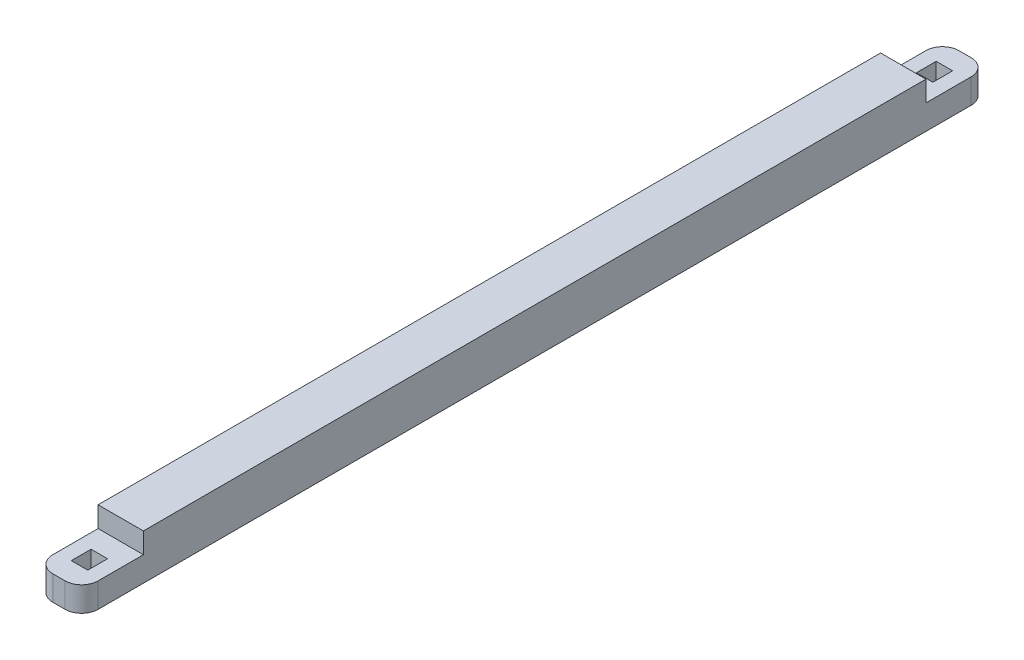
ISO-10303-21;
HEADER;
FILE_DESCRIPTION(('STEP AP214'),'2;1');
FILE_NAME('part.step','',(''),(''),'','','');
FILE_SCHEMA(('AUTOMOTIVE_DESIGN { 1 0 10303 214 1 1 1 1 }'));
ENDSEC;
DATA;
#1=APPLICATION_CONTEXT('core data for automotive mechanical design processes');
#2=APPLICATION_PROTOCOL_DEFINITION('international standard','automotive_design',2000,#1);
#3=PRODUCT_CONTEXT('',#1,'mechanical');
#4=PRODUCT('Part','Part','',(#3));
#5=PRODUCT_RELATED_PRODUCT_CATEGORY('part','',(#4));
#6=PRODUCT_DEFINITION_FORMATION('','',#4);
#7=PRODUCT_DEFINITION_CONTEXT('part definition',#1,'design');
#8=PRODUCT_DEFINITION('design','',#6,#7);
#9=PRODUCT_DEFINITION_SHAPE('','',#8);
#10=(LENGTH_UNIT() NAMED_UNIT(*) SI_UNIT(.MILLI.,.METRE.));
#11=(NAMED_UNIT(*) PLANE_ANGLE_UNIT() SI_UNIT($,.RADIAN.));
#12=(NAMED_UNIT(*) SI_UNIT($,.STERADIAN.) SOLID_ANGLE_UNIT());
#13=UNCERTAINTY_MEASURE_WITH_UNIT(LENGTH_MEASURE(1.E-05),#10,'distance_accuracy_value','');
#14=(GEOMETRIC_REPRESENTATION_CONTEXT(3) GLOBAL_UNCERTAINTY_ASSIGNED_CONTEXT((#13)) GLOBAL_UNIT_ASSIGNED_CONTEXT((#10,
#11,#12)) REPRESENTATION_CONTEXT('',''));
#15=CARTESIAN_POINT('',(0.,0.,0.));
#16=DIRECTION('',(0.,0.,1.));
#17=DIRECTION('',(1.,0.,0.));
#18=AXIS2_PLACEMENT_3D('',#15,#16,#17);
#19=CARTESIAN_POINT('',(168.743664037034,78.7240727028034,698.5));
#20=DIRECTION('',(1.,0.,0.));
#21=DIRECTION('',(0.,0.,-1.));
#22=AXIS2_PLACEMENT_3D('',#19,#20,#21);
#23=PLANE('',#22);
#24=DIRECTION('',(0.,0.,-1.));
#25=VECTOR('',#24,1.);
#26=CARTESIAN_POINT('',(168.743664037034,62.8490727028044,698.5));
#27=LINE('',#26,#25);
#28=CARTESIAN_POINT('',(168.743664037034,62.8490727028035,47.625));
#29=VERTEX_POINT('',#28);
#30=CARTESIAN_POINT('',(168.743664037034,62.8490727028034,12.7));
#31=VERTEX_POINT('',#30);
#32=EDGE_CURVE('E263',#29,#31,#27,.T.);
#33=ORIENTED_EDGE('',*,*,#32,.T.);
#34=DIRECTION('',(0.,-1.,0.));
#35=VECTOR('',#34,1.);
#36=CARTESIAN_POINT('',(168.743664037034,78.7240727028034,12.7));
#37=LINE('',#36,#35);
#38=CARTESIAN_POINT('',(168.743664037034,43.7990727028034,12.7));
#39=VERTEX_POINT('',#38);
#40=EDGE_CURVE('E323',#31,#39,#37,.T.);
#41=ORIENTED_EDGE('',*,*,#40,.T.);
#42=DIRECTION('',(0.,0.,-1.));
#43=VECTOR('',#42,1.);
#44=CARTESIAN_POINT('',(168.743664037034,43.7990727028034,698.5));
#45=LINE('',#44,#43);
#46=CARTESIAN_POINT('',(168.743664037034,43.7990727028034,685.8));
#47=VERTEX_POINT('',#46);
#48=EDGE_CURVE('E311',#47,#39,#45,.T.);
#49=ORIENTED_EDGE('',*,*,#48,.F.);
#50=DIRECTION('',(0.,-1.,0.));
#51=VECTOR('',#50,1.);
#52=CARTESIAN_POINT('',(168.743664037034,62.8490727028034,685.8));
#53=LINE('',#52,#51);
#54=CARTESIAN_POINT('',(168.743664037034,62.8490727028034,685.8));
#55=VERTEX_POINT('',#54);
#56=EDGE_CURVE('E321',#47,#55,#53,.F.);
#57=ORIENTED_EDGE('',*,*,#56,.T.);
#58=DIRECTION('',(0.,0.,-1.));
#59=VECTOR('',#58,1.);
#60=CARTESIAN_POINT('',(168.743664037034,62.8490727028034,698.5));
#61=LINE('',#60,#59);
#62=CARTESIAN_POINT('',(168.743664037034,62.8490727028034,650.875));
#63=VERTEX_POINT('',#62);
#64=EDGE_CURVE('E282',#55,#63,#61,.T.);
#65=ORIENTED_EDGE('',*,*,#64,.T.);
#66=DIRECTION('',(0.,1.,0.));
#67=VECTOR('',#66,1.);
#68=CARTESIAN_POINT('',(168.743664037034,78.7240727028034,650.875));
#69=LINE('',#68,#67);
#70=CARTESIAN_POINT('',(168.743664037034,78.7240727028034,650.875));
#71=VERTEX_POINT('',#70);
#72=EDGE_CURVE('E288',#63,#71,#69,.T.);
#73=ORIENTED_EDGE('',*,*,#72,.T.);
#74=DIRECTION('',(0.,0.,-1.));
#75=VECTOR('',#74,1.);
#76=CARTESIAN_POINT('',(168.743664037034,78.7240727028034,698.5));
#77=LINE('',#76,#75);
#78=CARTESIAN_POINT('',(168.743664037034,78.7240727028035,47.625));
#79=VERTEX_POINT('',#78);
#80=EDGE_CURVE('E297',#71,#79,#77,.T.);
#81=ORIENTED_EDGE('',*,*,#80,.T.);
#82=DIRECTION('',(0.,-1.,0.));
#83=VECTOR('',#82,1.);
#84=CARTESIAN_POINT('',(168.743664037034,78.7240727028034,47.625));
#85=LINE('',#84,#83);
#86=EDGE_CURVE('E268',#79,#29,#85,.T.);
#87=ORIENTED_EDGE('',*,*,#86,.T.);
#88=EDGE_LOOP('',(#33,#41,#49,#57,#65,#73,#81,#87));
#89=FACE_BOUND('',#88,.T.);
#90=ADVANCED_FACE('F34',(#89),#23,.F.);
#91=CARTESIAN_POINT('',(168.743664037034,43.7990727028034,698.5));
#92=DIRECTION('',(0.,1.,0.));
#93=DIRECTION('',(0.,0.,1.));
#94=AXIS2_PLACEMENT_3D('',#91,#92,#93);
#95=PLANE('',#94);
#96=DIRECTION('',(-1.,0.,0.));
#97=VECTOR('',#96,1.);
#98=CARTESIAN_POINT('',(179.856164037034,43.7990727028034,15.8750000000001));
#99=LINE('',#98,#97);
#100=CARTESIAN_POINT('',(192.556164037034,43.7990727028034,15.8750000000001));
#101=VERTEX_POINT('',#100);
#102=CARTESIAN_POINT('',(179.856164037034,43.7990727028034,15.8750000000001));
#103=VERTEX_POINT('',#102);
#104=EDGE_CURVE('E183',#101,#103,#99,.T.);
#105=ORIENTED_EDGE('',*,*,#104,.T.);
#106=DIRECTION('',(0.,0.,1.));
#107=VECTOR('',#106,1.);
#108=CARTESIAN_POINT('',(179.856164037034,43.7990727028034,31.115));
#109=LINE('',#108,#107);
#110=CARTESIAN_POINT('',(179.856164037034,43.7990727028034,31.115));
#111=VERTEX_POINT('',#110);
#112=EDGE_CURVE('E175',#103,#111,#109,.T.);
#113=ORIENTED_EDGE('',*,*,#112,.T.);
#114=DIRECTION('',(1.,0.,0.));
#115=VECTOR('',#114,1.);
#116=CARTESIAN_POINT('',(179.856164037034,43.7990727028034,31.115));
#117=LINE('',#116,#115);
#118=CARTESIAN_POINT('',(192.556164037034,43.7990727028034,31.115));
#119=VERTEX_POINT('',#118);
#120=EDGE_CURVE('E187',#111,#119,#117,.T.);
#121=ORIENTED_EDGE('',*,*,#120,.T.);
#122=DIRECTION('',(0.,0.,-1.));
#123=VECTOR('',#122,1.);
#124=CARTESIAN_POINT('',(192.556164037034,43.7990727028034,31.115));
#125=LINE('',#124,#123);
#126=EDGE_CURVE('E191',#119,#101,#125,.T.);
#127=ORIENTED_EDGE('',*,*,#126,.T.);
#128=EDGE_LOOP('',(#105,#113,#121,#127));
#129=FACE_BOUND('',#128,.T.);
#130=DIRECTION('',(-1.,0.,0.));
#131=VECTOR('',#130,1.);
#132=CARTESIAN_POINT('',(179.856164037034,43.7990727028032,667.385));
#133=LINE('',#132,#131);
#134=CARTESIAN_POINT('',(192.556164037034,43.7990727028032,667.385));
#135=VERTEX_POINT('',#134);
#136=CARTESIAN_POINT('',(179.856164037034,43.7990727028032,667.385));
#137=VERTEX_POINT('',#136);
#138=EDGE_CURVE('E227',#135,#137,#133,.T.);
#139=ORIENTED_EDGE('',*,*,#138,.T.);
#140=DIRECTION('',(0.,0.,1.));
#141=VECTOR('',#140,1.);
#142=CARTESIAN_POINT('',(179.856164037034,43.7990727028032,667.385));
#143=LINE('',#142,#141);
#144=CARTESIAN_POINT('',(179.856164037034,43.7990727028032,682.625));
#145=VERTEX_POINT('',#144);
#146=EDGE_CURVE('E216',#137,#145,#143,.T.);
#147=ORIENTED_EDGE('',*,*,#146,.T.);
#148=DIRECTION('',(1.,0.,0.));
#149=VECTOR('',#148,1.);
#150=CARTESIAN_POINT('',(179.856164037034,43.7990727028032,682.625));
#151=LINE('',#150,#149);
#152=CARTESIAN_POINT('',(192.556164037034,43.7990727028034,682.625));
#153=VERTEX_POINT('',#152);
#154=EDGE_CURVE('E219',#145,#153,#151,.T.);
#155=ORIENTED_EDGE('',*,*,#154,.T.);
#156=DIRECTION('',(0.,0.,-1.));
#157=VECTOR('',#156,1.);
#158=CARTESIAN_POINT('',(192.556164037034,43.7990727028032,667.385));
#159=LINE('',#158,#157);
#160=EDGE_CURVE('E224',#153,#135,#159,.T.);
#161=ORIENTED_EDGE('',*,*,#160,.T.);
#162=EDGE_LOOP('',(#139,#147,#155,#161));
#163=FACE_BOUND('',#162,.T.);
#164=ORIENTED_EDGE('',*,*,#48,.T.);
#165=CARTESIAN_POINT('',(181.443664037034,43.7990727028034,12.7));
#166=DIRECTION('',(0.,1.,0.));
#167=DIRECTION('',(0.,0.,1.));
#168=AXIS2_PLACEMENT_3D('',#165,#166,#167);
#169=CIRCLE('',#168,12.7);
#170=CARTESIAN_POINT('',(181.443664037034,43.7990727028034,0.));
#171=VERTEX_POINT('',#170);
#172=EDGE_CURVE('E334',#39,#171,#169,.F.);
#173=ORIENTED_EDGE('',*,*,#172,.T.);
#174=DIRECTION('',(1.,0.,0.));
#175=VECTOR('',#174,1.);
#176=CARTESIAN_POINT('',(168.743664037034,43.7990727028034,0.));
#177=LINE('',#176,#175);
#178=CARTESIAN_POINT('',(190.968664037034,43.7990727028034,0.));
#179=VERTEX_POINT('',#178);
#180=EDGE_CURVE('E292',#171,#179,#177,.T.);
#181=ORIENTED_EDGE('',*,*,#180,.T.);
#182=CARTESIAN_POINT('',(190.968664037034,43.7990727028034,12.7));
#183=DIRECTION('',(0.,1.,0.));
#184=DIRECTION('',(0.,0.,1.));
#185=AXIS2_PLACEMENT_3D('',#182,#183,#184);
#186=CIRCLE('',#185,12.7);
#187=CARTESIAN_POINT('',(203.668664037034,43.7990727028034,12.7));
#188=VERTEX_POINT('',#187);
#189=EDGE_CURVE('E332',#179,#188,#186,.F.);
#190=ORIENTED_EDGE('',*,*,#189,.T.);
#191=DIRECTION('',(0.,0.,-1.));
#192=VECTOR('',#191,1.);
#193=CARTESIAN_POINT('',(203.668664037034,43.7990727028034,698.5));
#194=LINE('',#193,#192);
#195=CARTESIAN_POINT('',(203.668664037034,43.7990727028034,685.8));
#196=VERTEX_POINT('',#195);
#197=EDGE_CURVE('E307',#196,#188,#194,.T.);
#198=ORIENTED_EDGE('',*,*,#197,.F.);
#199=CARTESIAN_POINT('',(190.968664037034,43.7990727028034,685.8));
#200=DIRECTION('',(0.,1.,0.));
#201=DIRECTION('',(0.,0.,1.));
#202=AXIS2_PLACEMENT_3D('',#199,#200,#201);
#203=CIRCLE('',#202,12.7);
#204=CARTESIAN_POINT('',(190.968664037034,43.7990727028034,698.5));
#205=VERTEX_POINT('',#204);
#206=EDGE_CURVE('E329',#196,#205,#203,.F.);
#207=ORIENTED_EDGE('',*,*,#206,.T.);
#208=DIRECTION('',(1.,0.,0.));
#209=VECTOR('',#208,1.);
#210=CARTESIAN_POINT('',(168.743664037034,43.7990727028034,698.5));
#211=LINE('',#210,#209);
#212=CARTESIAN_POINT('',(181.443664037034,43.7990727028034,698.5));
#213=VERTEX_POINT('',#212);
#214=EDGE_CURVE('E293',#213,#205,#211,.T.);
#215=ORIENTED_EDGE('',*,*,#214,.F.);
#216=CARTESIAN_POINT('',(181.443664037034,43.7990727028034,685.8));
#217=DIRECTION('',(0.,1.,0.));
#218=DIRECTION('',(0.,0.,1.));
#219=AXIS2_PLACEMENT_3D('',#216,#217,#218);
#220=CIRCLE('',#219,12.7);
#221=EDGE_CURVE('E326',#213,#47,#220,.F.);
#222=ORIENTED_EDGE('',*,*,#221,.T.);
#223=EDGE_LOOP('',(#164,#173,#181,#190,#198,#207,#215,#222));
#224=FACE_BOUND('',#223,.T.);
#225=ADVANCED_FACE('F193',(#129,#163,#224),#95,.F.);
#226=CARTESIAN_POINT('',(203.668664037034,78.7240727028034,698.5));
#227=DIRECTION('',(-1.,0.,0.));
#228=DIRECTION('',(0.,0.,1.));
#229=AXIS2_PLACEMENT_3D('',#226,#227,#228);
#230=PLANE('',#229);
#231=ORIENTED_EDGE('',*,*,#197,.T.);
#232=DIRECTION('',(0.,1.,0.));
#233=VECTOR('',#232,1.);
#234=CARTESIAN_POINT('',(203.668664037034,78.7240727028034,12.7));
#235=LINE('',#234,#233);
#236=CARTESIAN_POINT('',(203.668664037034,62.8490727028034,12.7));
#237=VERTEX_POINT('',#236);
#238=EDGE_CURVE('E349',#188,#237,#235,.T.);
#239=ORIENTED_EDGE('',*,*,#238,.T.);
#240=DIRECTION('',(0.,0.,-1.));
#241=VECTOR('',#240,1.);
#242=CARTESIAN_POINT('',(203.668664037034,62.8490727028034,0.));
#243=LINE('',#242,#241);
#244=CARTESIAN_POINT('',(203.668664037034,62.8490727028035,47.625));
#245=VERTEX_POINT('',#244);
#246=EDGE_CURVE('E256',#245,#237,#243,.T.);
#247=ORIENTED_EDGE('',*,*,#246,.F.);
#248=DIRECTION('',(0.,-1.,0.));
#249=VECTOR('',#248,1.);
#250=CARTESIAN_POINT('',(203.668664037034,78.7240727028035,47.625));
#251=LINE('',#250,#249);
#252=CARTESIAN_POINT('',(203.668664037034,78.7240727028035,47.625));
#253=VERTEX_POINT('',#252);
#254=EDGE_CURVE('E246',#253,#245,#251,.T.);
#255=ORIENTED_EDGE('',*,*,#254,.F.);
#256=DIRECTION('',(0.,0.,-1.));
#257=VECTOR('',#256,1.);
#258=CARTESIAN_POINT('',(203.668664037034,78.7240727028034,698.5));
#259=LINE('',#258,#257);
#260=CARTESIAN_POINT('',(203.668664037034,78.7240727028034,650.875));
#261=VERTEX_POINT('',#260);
#262=EDGE_CURVE('E303',#261,#253,#259,.T.);
#263=ORIENTED_EDGE('',*,*,#262,.F.);
#264=DIRECTION('',(0.,1.,0.));
#265=VECTOR('',#264,1.);
#266=CARTESIAN_POINT('',(203.668664037034,78.7240727028034,650.875));
#267=LINE('',#266,#265);
#268=CARTESIAN_POINT('',(203.668664037034,62.8490727028034,650.875));
#269=VERTEX_POINT('',#268);
#270=EDGE_CURVE('E274',#269,#261,#267,.T.);
#271=ORIENTED_EDGE('',*,*,#270,.F.);
#272=DIRECTION('',(0.,0.,-1.));
#273=VECTOR('',#272,1.);
#274=CARTESIAN_POINT('',(203.668664037034,62.8490727028034,698.5));
#275=LINE('',#274,#273);
#276=CARTESIAN_POINT('',(203.668664037034,62.8490727028034,685.8));
#277=VERTEX_POINT('',#276);
#278=EDGE_CURVE('E271',#277,#269,#275,.T.);
#279=ORIENTED_EDGE('',*,*,#278,.F.);
#280=DIRECTION('',(0.,1.,0.));
#281=VECTOR('',#280,1.);
#282=CARTESIAN_POINT('',(203.668664037034,43.7990727028034,685.8));
#283=LINE('',#282,#281);
#284=EDGE_CURVE('E346',#277,#196,#283,.F.);
#285=ORIENTED_EDGE('',*,*,#284,.T.);
#286=EDGE_LOOP('',(#231,#239,#247,#255,#263,#271,#279,#285));
#287=FACE_BOUND('',#286,.T.);
#288=ADVANCED_FACE('F371',(#287),#230,.F.);
#289=CARTESIAN_POINT('',(168.743664037034,78.7240727028034,698.5));
#290=DIRECTION('',(0.,-1.,0.));
#291=DIRECTION('',(0.,0.,-1.));
#292=AXIS2_PLACEMENT_3D('',#289,#290,#291);
#293=PLANE('',#292);
#294=ORIENTED_EDGE('',*,*,#262,.T.);
#295=DIRECTION('',(1.,0.,0.));
#296=VECTOR('',#295,1.);
#297=CARTESIAN_POINT('',(76.668664037034,78.7240727028035,47.625));
#298=LINE('',#297,#296);
#299=EDGE_CURVE('E260',#79,#253,#298,.T.);
#300=ORIENTED_EDGE('',*,*,#299,.F.);
#301=ORIENTED_EDGE('',*,*,#80,.F.);
#302=DIRECTION('',(1.,0.,0.));
#303=VECTOR('',#302,1.);
#304=CARTESIAN_POINT('',(76.668664037034,78.7240727028034,650.875));
#305=LINE('',#304,#303);
#306=EDGE_CURVE('E278',#71,#261,#305,.T.);
#307=ORIENTED_EDGE('',*,*,#306,.T.);
#308=EDGE_LOOP('',(#294,#300,#301,#307));
#309=FACE_BOUND('',#308,.T.);
#310=ADVANCED_FACE('F402',(#309),#293,.F.);
#311=CARTESIAN_POINT('',(0.,0.,698.5));
#312=DIRECTION('',(0.,0.,1.));
#313=DIRECTION('',(1.,0.,0.));
#314=AXIS2_PLACEMENT_3D('',#311,#312,#313);
#315=PLANE('',#314);
#316=ORIENTED_EDGE('',*,*,#214,.T.);
#317=DIRECTION('',(0.,1.,0.));
#318=VECTOR('',#317,1.);
#319=CARTESIAN_POINT('',(190.968664037034,62.8490727028034,698.5));
#320=LINE('',#319,#318);
#321=CARTESIAN_POINT('',(190.968664037034,62.8490727028034,698.5));
#322=VERTEX_POINT('',#321);
#323=EDGE_CURVE('E356',#205,#322,#320,.T.);
#324=ORIENTED_EDGE('',*,*,#323,.T.);
#325=DIRECTION('',(1.,0.,0.));
#326=VECTOR('',#325,1.);
#327=CARTESIAN_POINT('',(0.,62.8490727028034,698.5));
#328=LINE('',#327,#326);
#329=CARTESIAN_POINT('',(181.443664037034,62.8490727028034,698.5));
#330=VERTEX_POINT('',#329);
#331=EDGE_CURVE('E315',#330,#322,#328,.T.);
#332=ORIENTED_EDGE('',*,*,#331,.F.);
#333=DIRECTION('',(0.,-1.,0.));
#334=VECTOR('',#333,1.);
#335=CARTESIAN_POINT('',(181.443664037034,43.7990727028034,698.5));
#336=LINE('',#335,#334);
#337=EDGE_CURVE('E352',#330,#213,#336,.T.);
#338=ORIENTED_EDGE('',*,*,#337,.T.);
#339=EDGE_LOOP('',(#316,#324,#332,#338));
#340=FACE_BOUND('',#339,.T.);
#341=ADVANCED_FACE('F362',(#340),#315,.T.);
#342=CARTESIAN_POINT('',(0.,0.,0.));
#343=DIRECTION('',(0.,0.,1.));
#344=DIRECTION('',(1.,0.,0.));
#345=AXIS2_PLACEMENT_3D('',#342,#343,#344);
#346=PLANE('',#345);
#347=ORIENTED_EDGE('',*,*,#180,.F.);
#348=DIRECTION('',(0.,-1.,0.));
#349=VECTOR('',#348,1.);
#350=CARTESIAN_POINT('',(181.443664037034,0.,0.));
#351=LINE('',#350,#349);
#352=CARTESIAN_POINT('',(181.443664037034,62.8490727028034,0.));
#353=VERTEX_POINT('',#352);
#354=EDGE_CURVE('E338',#171,#353,#351,.F.);
#355=ORIENTED_EDGE('',*,*,#354,.T.);
#356=DIRECTION('',(1.,0.,0.));
#357=VECTOR('',#356,1.);
#358=CARTESIAN_POINT('',(0.,62.8490727028034,0.));
#359=LINE('',#358,#357);
#360=CARTESIAN_POINT('',(190.968664037034,62.8490727028034,0.));
#361=VERTEX_POINT('',#360);
#362=EDGE_CURVE('E318',#353,#361,#359,.T.);
#363=ORIENTED_EDGE('',*,*,#362,.T.);
#364=DIRECTION('',(0.,1.,0.));
#365=VECTOR('',#364,1.);
#366=CARTESIAN_POINT('',(190.968664037034,0.,0.));
#367=LINE('',#366,#365);
#368=EDGE_CURVE('E336',#361,#179,#367,.F.);
#369=ORIENTED_EDGE('',*,*,#368,.T.);
#370=EDGE_LOOP('',(#347,#355,#363,#369));
#371=FACE_BOUND('',#370,.T.);
#372=ADVANCED_FACE('F388',(#371),#346,.F.);
#373=CARTESIAN_POINT('',(76.668664037034,78.7240727028034,650.875));
#374=DIRECTION('',(0.,0.,-1.));
#375=DIRECTION('',(-1.,0.,0.));
#376=AXIS2_PLACEMENT_3D('',#373,#374,#375);
#377=PLANE('',#376);
#378=DIRECTION('',(1.,0.,0.));
#379=VECTOR('',#378,1.);
#380=CARTESIAN_POINT('',(76.668664037034,62.8490727028034,650.875));
#381=LINE('',#380,#379);
#382=EDGE_CURVE('E277',#63,#269,#381,.T.);
#383=ORIENTED_EDGE('',*,*,#382,.T.);
#384=ORIENTED_EDGE('',*,*,#270,.T.);
#385=ORIENTED_EDGE('',*,*,#306,.F.);
#386=ORIENTED_EDGE('',*,*,#72,.F.);
#387=EDGE_LOOP('',(#383,#384,#385,#386));
#388=FACE_BOUND('',#387,.T.);
#389=ADVANCED_FACE('F405',(#388),#377,.F.);
#390=CARTESIAN_POINT('',(76.668664037034,62.8490727028034,698.5));
#391=DIRECTION('',(0.,-1.,0.));
#392=DIRECTION('',(0.,0.,-1.));
#393=AXIS2_PLACEMENT_3D('',#390,#391,#392);
#394=PLANE('',#393);
#395=DIRECTION('',(1.,0.,0.));
#396=VECTOR('',#395,1.);
#397=CARTESIAN_POINT('',(179.856164037034,62.8490727028034,682.625));
#398=LINE('',#397,#396);
#399=CARTESIAN_POINT('',(179.856164037034,62.8490727028034,682.625));
#400=VERTEX_POINT('',#399);
#401=CARTESIAN_POINT('',(192.556164037034,62.8490727028034,682.625));
#402=VERTEX_POINT('',#401);
#403=EDGE_CURVE('E233',#400,#402,#398,.T.);
#404=ORIENTED_EDGE('',*,*,#403,.F.);
#405=DIRECTION('',(0.,0.,1.));
#406=VECTOR('',#405,1.);
#407=CARTESIAN_POINT('',(179.856164037034,62.8490727028034,667.385));
#408=LINE('',#407,#406);
#409=CARTESIAN_POINT('',(179.856164037034,62.8490727028034,667.385));
#410=VERTEX_POINT('',#409);
#411=EDGE_CURVE('E212',#410,#400,#408,.T.);
#412=ORIENTED_EDGE('',*,*,#411,.F.);
#413=DIRECTION('',(-1.,0.,0.));
#414=VECTOR('',#413,1.);
#415=CARTESIAN_POINT('',(179.856164037034,62.8490727028034,667.385));
#416=LINE('',#415,#414);
#417=CARTESIAN_POINT('',(192.556164037034,62.8490727028034,667.385));
#418=VERTEX_POINT('',#417);
#419=EDGE_CURVE('E220',#418,#410,#416,.T.);
#420=ORIENTED_EDGE('',*,*,#419,.F.);
#421=DIRECTION('',(0.,0.,-1.));
#422=VECTOR('',#421,1.);
#423=CARTESIAN_POINT('',(192.556164037034,62.8490727028034,667.385));
#424=LINE('',#423,#422);
#425=EDGE_CURVE('E237',#402,#418,#424,.T.);
#426=ORIENTED_EDGE('',*,*,#425,.F.);
#427=EDGE_LOOP('',(#404,#412,#420,#426));
#428=FACE_BOUND('',#427,.T.);
#429=ORIENTED_EDGE('',*,*,#331,.T.);
#430=CARTESIAN_POINT('',(190.968664037034,62.8490727028034,685.8));
#431=DIRECTION('',(0.,-1.,0.));
#432=DIRECTION('',(0.,0.,-1.));
#433=AXIS2_PLACEMENT_3D('',#430,#431,#432);
#434=CIRCLE('',#433,12.7);
#435=EDGE_CURVE('E11',#322,#277,#434,.F.);
#436=ORIENTED_EDGE('',*,*,#435,.T.);
#437=ORIENTED_EDGE('',*,*,#278,.T.);
#438=ORIENTED_EDGE('',*,*,#382,.F.);
#439=ORIENTED_EDGE('',*,*,#64,.F.);
#440=CARTESIAN_POINT('',(181.443664037034,62.8490727028034,685.8));
#441=DIRECTION('',(0.,-1.,0.));
#442=DIRECTION('',(0.,0.,-1.));
#443=AXIS2_PLACEMENT_3D('',#440,#441,#442);
#444=CIRCLE('',#443,12.7);
#445=EDGE_CURVE('E42',#55,#330,#444,.F.);
#446=ORIENTED_EDGE('',*,*,#445,.T.);
#447=EDGE_LOOP('',(#429,#436,#437,#438,#439,#446));
#448=FACE_BOUND('',#447,.T.);
#449=ADVANCED_FACE('F366',(#428,#448),#394,.F.);
#450=CARTESIAN_POINT('',(76.668664037034,78.7240727028035,47.625));
#451=DIRECTION('',(0.,0.,1.));
#452=DIRECTION('',(1.,0.,0.));
#453=AXIS2_PLACEMENT_3D('',#450,#451,#452);
#454=PLANE('',#453);
#455=ORIENTED_EDGE('',*,*,#299,.T.);
#456=ORIENTED_EDGE('',*,*,#254,.T.);
#457=DIRECTION('',(1.,0.,0.));
#458=VECTOR('',#457,1.);
#459=CARTESIAN_POINT('',(76.668664037034,62.8490727028035,47.625));
#460=LINE('',#459,#458);
#461=EDGE_CURVE('E261',#29,#245,#460,.T.);
#462=ORIENTED_EDGE('',*,*,#461,.F.);
#463=ORIENTED_EDGE('',*,*,#86,.F.);
#464=EDGE_LOOP('',(#455,#456,#462,#463));
#465=FACE_BOUND('',#464,.T.);
#466=ADVANCED_FACE('F399',(#465),#454,.F.);
#467=CARTESIAN_POINT('',(76.668664037034,62.8490727028034,0.));
#468=DIRECTION('',(0.,-1.,0.));
#469=DIRECTION('',(0.,0.,-1.));
#470=AXIS2_PLACEMENT_3D('',#467,#468,#469);
#471=PLANE('',#470);
#472=DIRECTION('',(1.,0.,0.));
#473=VECTOR('',#472,1.);
#474=CARTESIAN_POINT('',(179.856164037034,62.8490727028036,31.115));
#475=LINE('',#474,#473);
#476=CARTESIAN_POINT('',(179.856164037034,62.8490727028034,31.115));
#477=VERTEX_POINT('',#476);
#478=CARTESIAN_POINT('',(192.556164037034,62.8490727028036,31.115));
#479=VERTEX_POINT('',#478);
#480=EDGE_CURVE('E206',#477,#479,#475,.T.);
#481=ORIENTED_EDGE('',*,*,#480,.F.);
#482=DIRECTION('',(0.,0.,1.));
#483=VECTOR('',#482,1.);
#484=CARTESIAN_POINT('',(179.856164037034,62.8490727028036,31.115));
#485=LINE('',#484,#483);
#486=CARTESIAN_POINT('',(179.856164037034,62.8490727028036,15.8750000000001));
#487=VERTEX_POINT('',#486);
#488=EDGE_CURVE('E178',#487,#477,#485,.T.);
#489=ORIENTED_EDGE('',*,*,#488,.F.);
#490=DIRECTION('',(-1.,0.,0.));
#491=VECTOR('',#490,1.);
#492=CARTESIAN_POINT('',(179.856164037034,62.8490727028036,15.8750000000001));
#493=LINE('',#492,#491);
#494=CARTESIAN_POINT('',(192.556164037034,62.8490727028036,15.8750000000001));
#495=VERTEX_POINT('',#494);
#496=EDGE_CURVE('E196',#495,#487,#493,.T.);
#497=ORIENTED_EDGE('',*,*,#496,.F.);
#498=DIRECTION('',(0.,0.,-1.));
#499=VECTOR('',#498,1.);
#500=CARTESIAN_POINT('',(192.556164037034,62.8490727028036,31.115));
#501=LINE('',#500,#499);
#502=EDGE_CURVE('E199',#479,#495,#501,.T.);
#503=ORIENTED_EDGE('',*,*,#502,.F.);
#504=EDGE_LOOP('',(#481,#489,#497,#503));
#505=FACE_BOUND('',#504,.T.);
#506=ORIENTED_EDGE('',*,*,#362,.F.);
#507=CARTESIAN_POINT('',(181.443664037034,62.8490727028034,12.7));
#508=DIRECTION('',(0.,-1.,0.));
#509=DIRECTION('',(0.,0.,-1.));
#510=AXIS2_PLACEMENT_3D('',#507,#508,#509);
#511=CIRCLE('',#510,12.7);
#512=EDGE_CURVE('E344',#353,#31,#511,.F.);
#513=ORIENTED_EDGE('',*,*,#512,.T.);
#514=ORIENTED_EDGE('',*,*,#32,.F.);
#515=ORIENTED_EDGE('',*,*,#461,.T.);
#516=ORIENTED_EDGE('',*,*,#246,.T.);
#517=CARTESIAN_POINT('',(190.968664037034,62.8490727028034,12.7));
#518=DIRECTION('',(0.,-1.,0.));
#519=DIRECTION('',(0.,0.,-1.));
#520=AXIS2_PLACEMENT_3D('',#517,#518,#519);
#521=CIRCLE('',#520,12.7);
#522=EDGE_CURVE('E341',#237,#361,#521,.F.);
#523=ORIENTED_EDGE('',*,*,#522,.T.);
#524=EDGE_LOOP('',(#506,#513,#514,#515,#516,#523));
#525=FACE_BOUND('',#524,.T.);
#526=ADVANCED_FACE('F384',(#505,#525),#471,.F.);
#527=CARTESIAN_POINT('',(179.856164037034,43.7990727028032,667.385));
#528=DIRECTION('',(-1.,0.,0.));
#529=DIRECTION('',(0.,0.,1.));
#530=AXIS2_PLACEMENT_3D('',#527,#528,#529);
#531=PLANE('',#530);
#532=ORIENTED_EDGE('',*,*,#411,.T.);
#533=DIRECTION('',(0.,1.,0.));
#534=VECTOR('',#533,1.);
#535=CARTESIAN_POINT('',(179.856164037034,43.7990727028032,682.625));
#536=LINE('',#535,#534);
#537=EDGE_CURVE('E231',#145,#400,#536,.T.);
#538=ORIENTED_EDGE('',*,*,#537,.F.);
#539=ORIENTED_EDGE('',*,*,#146,.F.);
#540=DIRECTION('',(0.,1.,0.));
#541=VECTOR('',#540,1.);
#542=CARTESIAN_POINT('',(179.856164037034,43.7990727028032,667.385));
#543=LINE('',#542,#541);
#544=EDGE_CURVE('E243',#137,#410,#543,.T.);
#545=ORIENTED_EDGE('',*,*,#544,.T.);
#546=EDGE_LOOP('',(#532,#538,#539,#545));
#547=FACE_BOUND('',#546,.T.);
#548=ADVANCED_FACE('F505',(#547),#531,.F.);
#549=CARTESIAN_POINT('',(179.856164037034,43.7990727028032,667.385));
#550=DIRECTION('',(0.,0.,-1.));
#551=DIRECTION('',(0.,1.,0.));
#552=AXIS2_PLACEMENT_3D('',#549,#550,#551);
#553=PLANE('',#552);
#554=ORIENTED_EDGE('',*,*,#419,.T.);
#555=ORIENTED_EDGE('',*,*,#544,.F.);
#556=ORIENTED_EDGE('',*,*,#138,.F.);
#557=DIRECTION('',(0.,1.,0.));
#558=VECTOR('',#557,1.);
#559=CARTESIAN_POINT('',(192.556164037034,43.7990727028032,667.385));
#560=LINE('',#559,#558);
#561=EDGE_CURVE('E247',#135,#418,#560,.T.);
#562=ORIENTED_EDGE('',*,*,#561,.T.);
#563=EDGE_LOOP('',(#554,#555,#556,#562));
#564=FACE_BOUND('',#563,.T.);
#565=ADVANCED_FACE('F495',(#564),#553,.F.);
#566=CARTESIAN_POINT('',(192.556164037034,43.7990727028032,667.385));
#567=DIRECTION('',(1.,0.,0.));
#568=DIRECTION('',(0.,0.,-1.));
#569=AXIS2_PLACEMENT_3D('',#566,#567,#568);
#570=PLANE('',#569);
#571=ORIENTED_EDGE('',*,*,#425,.T.);
#572=ORIENTED_EDGE('',*,*,#561,.F.);
#573=ORIENTED_EDGE('',*,*,#160,.F.);
#574=DIRECTION('',(0.,1.,0.));
#575=VECTOR('',#574,1.);
#576=CARTESIAN_POINT('',(192.556164037034,43.7990727028032,682.625));
#577=LINE('',#576,#575);
#578=EDGE_CURVE('E249',#153,#402,#577,.T.);
#579=ORIENTED_EDGE('',*,*,#578,.T.);
#580=EDGE_LOOP('',(#571,#572,#573,#579));
#581=FACE_BOUND('',#580,.T.);
#582=ADVANCED_FACE('F486',(#581),#570,.F.);
#583=CARTESIAN_POINT('',(179.856164037034,43.7990727028032,682.625));
#584=DIRECTION('',(0.,0.,1.));
#585=DIRECTION('',(0.,-1.,0.));
#586=AXIS2_PLACEMENT_3D('',#583,#584,#585);
#587=PLANE('',#586);
#588=ORIENTED_EDGE('',*,*,#403,.T.);
#589=ORIENTED_EDGE('',*,*,#578,.F.);
#590=ORIENTED_EDGE('',*,*,#154,.F.);
#591=ORIENTED_EDGE('',*,*,#537,.T.);
#592=EDGE_LOOP('',(#588,#589,#590,#591));
#593=FACE_BOUND('',#592,.T.);
#594=ADVANCED_FACE('F478',(#593),#587,.F.);
#595=CARTESIAN_POINT('',(179.856164037034,43.7990727028034,31.115));
#596=DIRECTION('',(-1.,0.,0.));
#597=DIRECTION('',(0.,0.,1.));
#598=AXIS2_PLACEMENT_3D('',#595,#596,#597);
#599=PLANE('',#598);
#600=ORIENTED_EDGE('',*,*,#488,.T.);
#601=DIRECTION('',(0.,1.,0.));
#602=VECTOR('',#601,1.);
#603=CARTESIAN_POINT('',(179.856164037034,43.7990727028034,31.115));
#604=LINE('',#603,#602);
#605=EDGE_CURVE('E171',#111,#477,#604,.T.);
#606=ORIENTED_EDGE('',*,*,#605,.F.);
#607=ORIENTED_EDGE('',*,*,#112,.F.);
#608=DIRECTION('',(0.,1.,0.));
#609=VECTOR('',#608,1.);
#610=CARTESIAN_POINT('',(179.856164037034,43.7990727028034,15.8750000000001));
#611=LINE('',#610,#609);
#612=EDGE_CURVE('E210',#103,#487,#611,.T.);
#613=ORIENTED_EDGE('',*,*,#612,.T.);
#614=EDGE_LOOP('',(#600,#606,#607,#613));
#615=FACE_BOUND('',#614,.T.);
#616=ADVANCED_FACE('F173',(#615),#599,.F.);
#617=CARTESIAN_POINT('',(179.856164037034,43.7990727028034,15.8750000000001));
#618=DIRECTION('',(0.,0.,-1.));
#619=DIRECTION('',(0.,1.,0.));
#620=AXIS2_PLACEMENT_3D('',#617,#618,#619);
#621=PLANE('',#620);
#622=ORIENTED_EDGE('',*,*,#496,.T.);
#623=ORIENTED_EDGE('',*,*,#612,.F.);
#624=ORIENTED_EDGE('',*,*,#104,.F.);
#625=DIRECTION('',(0.,1.,0.));
#626=VECTOR('',#625,1.);
#627=CARTESIAN_POINT('',(192.556164037034,43.7990727028034,15.8750000000001));
#628=LINE('',#627,#626);
#629=EDGE_CURVE('E213',#101,#495,#628,.T.);
#630=ORIENTED_EDGE('',*,*,#629,.T.);
#631=EDGE_LOOP('',(#622,#623,#624,#630));
#632=FACE_BOUND('',#631,.T.);
#633=ADVANCED_FACE('F461',(#632),#621,.F.);
#634=CARTESIAN_POINT('',(192.556164037034,43.7990727028034,31.115));
#635=DIRECTION('',(1.,0.,0.));
#636=DIRECTION('',(0.,0.,-1.));
#637=AXIS2_PLACEMENT_3D('',#634,#635,#636);
#638=PLANE('',#637);
#639=ORIENTED_EDGE('',*,*,#502,.T.);
#640=ORIENTED_EDGE('',*,*,#629,.F.);
#641=ORIENTED_EDGE('',*,*,#126,.F.);
#642=DIRECTION('',(0.,1.,0.));
#643=VECTOR('',#642,1.);
#644=CARTESIAN_POINT('',(192.556164037034,43.7990727028034,31.115));
#645=LINE('',#644,#643);
#646=EDGE_CURVE('E182',#119,#479,#645,.T.);
#647=ORIENTED_EDGE('',*,*,#646,.T.);
#648=EDGE_LOOP('',(#639,#640,#641,#647));
#649=FACE_BOUND('',#648,.T.);
#650=ADVANCED_FACE('F452',(#649),#638,.F.);
#651=CARTESIAN_POINT('',(179.856164037034,43.7990727028034,31.115));
#652=DIRECTION('',(0.,0.,1.));
#653=DIRECTION('',(0.,-1.,0.));
#654=AXIS2_PLACEMENT_3D('',#651,#652,#653);
#655=PLANE('',#654);
#656=ORIENTED_EDGE('',*,*,#480,.T.);
#657=ORIENTED_EDGE('',*,*,#646,.F.);
#658=ORIENTED_EDGE('',*,*,#120,.F.);
#659=ORIENTED_EDGE('',*,*,#605,.T.);
#660=EDGE_LOOP('',(#656,#657,#658,#659));
#661=FACE_BOUND('',#660,.T.);
#662=ADVANCED_FACE('F188',(#661),#655,.F.);
#663=CARTESIAN_POINT('',(181.443664037034,78.7240727028034,12.7));
#664=DIRECTION('',(0.,-1.,0.));
#665=DIRECTION('',(0.,0.,-1.));
#666=AXIS2_PLACEMENT_3D('',#663,#664,#665);
#667=CYLINDRICAL_SURFACE('',#666,12.7);
#668=ORIENTED_EDGE('',*,*,#512,.F.);
#669=ORIENTED_EDGE('',*,*,#354,.F.);
#670=ORIENTED_EDGE('',*,*,#172,.F.);
#671=ORIENTED_EDGE('',*,*,#40,.F.);
#672=EDGE_LOOP('',(#668,#669,#670,#671));
#673=FACE_BOUND('',#672,.T.);
#674=ADVANCED_FACE('F391',(#673),#667,.T.);
#675=CARTESIAN_POINT('',(190.968664037034,78.7240727028034,12.7));
#676=DIRECTION('',(0.,1.,0.));
#677=DIRECTION('',(0.,0.,1.));
#678=AXIS2_PLACEMENT_3D('',#675,#676,#677);
#679=CYLINDRICAL_SURFACE('',#678,12.7);
#680=ORIENTED_EDGE('',*,*,#189,.F.);
#681=ORIENTED_EDGE('',*,*,#368,.F.);
#682=ORIENTED_EDGE('',*,*,#522,.F.);
#683=ORIENTED_EDGE('',*,*,#238,.F.);
#684=EDGE_LOOP('',(#680,#681,#682,#683));
#685=FACE_BOUND('',#684,.T.);
#686=ADVANCED_FACE('F380',(#685),#679,.T.);
#687=CARTESIAN_POINT('',(190.968664037034,0.,685.8));
#688=DIRECTION('',(0.,-1.,0.));
#689=DIRECTION('',(0.,0.,-1.));
#690=AXIS2_PLACEMENT_3D('',#687,#688,#689);
#691=CYLINDRICAL_SURFACE('',#690,12.7);
#692=ORIENTED_EDGE('',*,*,#206,.F.);
#693=ORIENTED_EDGE('',*,*,#284,.F.);
#694=ORIENTED_EDGE('',*,*,#435,.F.);
#695=ORIENTED_EDGE('',*,*,#323,.F.);
#696=EDGE_LOOP('',(#692,#693,#694,#695));
#697=FACE_BOUND('',#696,.T.);
#698=ADVANCED_FACE('F374',(#697),#691,.T.);
#699=CARTESIAN_POINT('',(181.443664037034,0.,685.8));
#700=DIRECTION('',(0.,1.,0.));
#701=DIRECTION('',(0.,0.,1.));
#702=AXIS2_PLACEMENT_3D('',#699,#700,#701);
#703=CYLINDRICAL_SURFACE('',#702,12.7);
#704=ORIENTED_EDGE('',*,*,#445,.F.);
#705=ORIENTED_EDGE('',*,*,#56,.F.);
#706=ORIENTED_EDGE('',*,*,#221,.F.);
#707=ORIENTED_EDGE('',*,*,#337,.F.);
#708=EDGE_LOOP('',(#704,#705,#706,#707));
#709=FACE_BOUND('',#708,.T.);
#710=ADVANCED_FACE('F36',(#709),#703,.T.);
#711=CLOSED_SHELL('',(#90,#225,#288,#310,#341,#372,#389,#449,#466,#526,#548,#565,#582,#594,#616,
#633,#650,#662,#674,#686,#698,#710));
#712=MANIFOLD_SOLID_BREP('B2',#711);
#713=ADVANCED_BREP_SHAPE_REPRESENTATION('',(#18,#712),#14);
#714=SHAPE_DEFINITION_REPRESENTATION(#9,#713);
ENDSEC;
END-ISO-10303-21;
